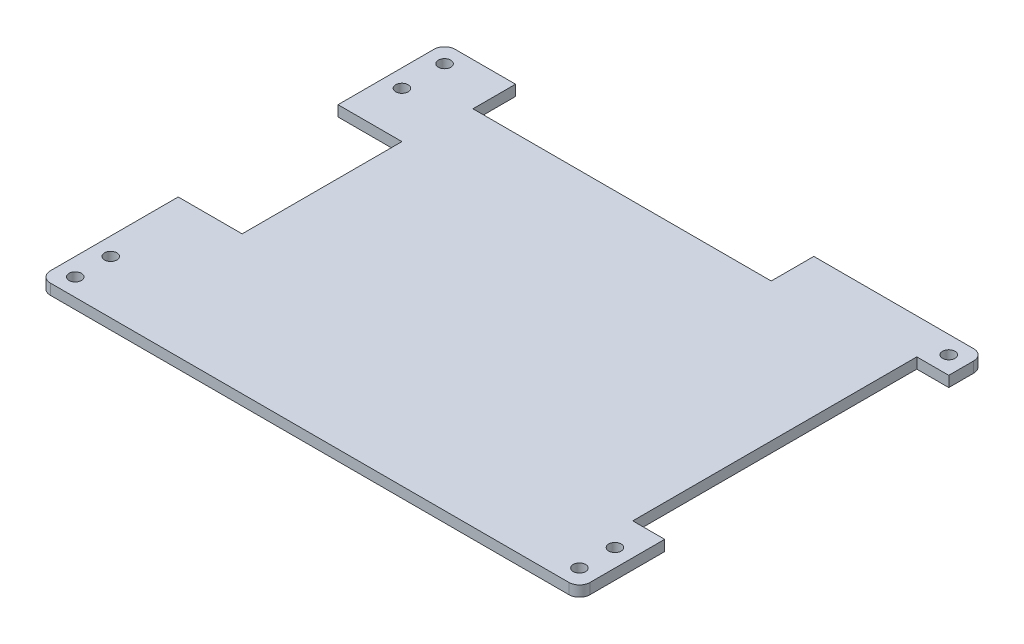
ISO-10303-21;
HEADER;
FILE_DESCRIPTION(('STEP AP214'),'2;1');
FILE_NAME('part.step','',(''),(''),'','','');
FILE_SCHEMA(('AUTOMOTIVE_DESIGN { 1 0 10303 214 1 1 1 1 }'));
ENDSEC;
DATA;
#1=APPLICATION_CONTEXT('core data for automotive mechanical design processes');
#2=APPLICATION_PROTOCOL_DEFINITION('international standard','automotive_design',2000,#1);
#3=PRODUCT_CONTEXT('',#1,'mechanical');
#4=PRODUCT('Part','Part','',(#3));
#5=PRODUCT_RELATED_PRODUCT_CATEGORY('part','',(#4));
#6=PRODUCT_DEFINITION_FORMATION('','',#4);
#7=PRODUCT_DEFINITION_CONTEXT('part definition',#1,'design');
#8=PRODUCT_DEFINITION('design','',#6,#7);
#9=PRODUCT_DEFINITION_SHAPE('','',#8);
#10=(LENGTH_UNIT() NAMED_UNIT(*) SI_UNIT(.MILLI.,.METRE.));
#11=(NAMED_UNIT(*) PLANE_ANGLE_UNIT() SI_UNIT($,.RADIAN.));
#12=(NAMED_UNIT(*) SI_UNIT($,.STERADIAN.) SOLID_ANGLE_UNIT());
#13=UNCERTAINTY_MEASURE_WITH_UNIT(LENGTH_MEASURE(1.E-05),#10,'distance_accuracy_value','');
#14=(GEOMETRIC_REPRESENTATION_CONTEXT(3) GLOBAL_UNCERTAINTY_ASSIGNED_CONTEXT((#13)) GLOBAL_UNIT_ASSIGNED_CONTEXT((#10,
#11,#12)) REPRESENTATION_CONTEXT('',''));
#15=CARTESIAN_POINT('',(0.,0.,0.));
#16=DIRECTION('',(0.,0.,1.));
#17=DIRECTION('',(1.,0.,0.));
#18=AXIS2_PLACEMENT_3D('',#15,#16,#17);
#19=CARTESIAN_POINT('',(-73.,3.,-54.));
#20=DIRECTION('',(0.,1.,0.));
#21=DIRECTION('',(0.,0.,1.));
#22=AXIS2_PLACEMENT_3D('',#19,#20,#21);
#23=PLANE('',#22);
#24=CARTESIAN_POINT('',(71.0000000000009,3.,42.));
#25=DIRECTION('',(0.,1.,0.));
#26=DIRECTION('',(0.,0.,1.));
#27=AXIS2_PLACEMENT_3D('',#24,#25,#26);
#28=CIRCLE('',#27,1.75);
#29=CARTESIAN_POINT('',(71.0000000000009,3.,43.75));
#30=VERTEX_POINT('',#29);
#31=EDGE_CURVE('E411',#30,#30,#28,.T.);
#32=ORIENTED_EDGE('',*,*,#31,.F.);
#33=EDGE_LOOP('',(#32));
#34=FACE_BOUND('',#33,.T.);
#35=CARTESIAN_POINT('',(-70.9999999999989,3.,52.));
#36=DIRECTION('',(0.,1.,0.));
#37=DIRECTION('',(0.,0.,1.));
#38=AXIS2_PLACEMENT_3D('',#35,#36,#37);
#39=CIRCLE('',#38,1.75);
#40=CARTESIAN_POINT('',(-70.9999999999989,3.,53.75));
#41=VERTEX_POINT('',#40);
#42=EDGE_CURVE('E423',#41,#41,#39,.T.);
#43=ORIENTED_EDGE('',*,*,#42,.F.);
#44=EDGE_LOOP('',(#43));
#45=FACE_BOUND('',#44,.T.);
#46=CARTESIAN_POINT('',(71.,3.,-52.));
#47=DIRECTION('',(0.,1.,0.));
#48=DIRECTION('',(0.,0.,1.));
#49=AXIS2_PLACEMENT_3D('',#46,#47,#48);
#50=CIRCLE('',#49,1.75);
#51=CARTESIAN_POINT('',(71.,3.,-50.25));
#52=VERTEX_POINT('',#51);
#53=EDGE_CURVE('E435',#52,#52,#50,.T.);
#54=ORIENTED_EDGE('',*,*,#53,.F.);
#55=EDGE_LOOP('',(#54));
#56=FACE_BOUND('',#55,.T.);
#57=CARTESIAN_POINT('',(-73.,3.,-54.));
#58=DIRECTION('',(0.,1.,0.));
#59=DIRECTION('',(0.,0.,1.));
#60=AXIS2_PLACEMENT_3D('',#57,#58,#59);
#61=CIRCLE('',#60,3.);
#62=CARTESIAN_POINT('',(-73.,3.,-57.));
#63=VERTEX_POINT('',#62);
#64=CARTESIAN_POINT('',(-76.,3.,-54.));
#65=VERTEX_POINT('',#64);
#66=EDGE_CURVE('E245',#63,#65,#61,.T.);
#67=ORIENTED_EDGE('',*,*,#66,.T.);
#68=DIRECTION('',(0.,0.,1.));
#69=VECTOR('',#68,1.);
#70=CARTESIAN_POINT('',(-76.,3.,-54.));
#71=LINE('',#70,#69);
#72=CARTESIAN_POINT('',(-76.,3.,-27.));
#73=VERTEX_POINT('',#72);
#74=EDGE_CURVE('E133',#65,#73,#71,.T.);
#75=ORIENTED_EDGE('',*,*,#74,.T.);
#76=DIRECTION('',(1.,0.,0.));
#77=VECTOR('',#76,1.);
#78=CARTESIAN_POINT('',(-76.,3.,-27.));
#79=LINE('',#78,#77);
#80=CARTESIAN_POINT('',(-58.,3.,-27.));
#81=VERTEX_POINT('',#80);
#82=EDGE_CURVE('E296',#73,#81,#79,.T.);
#83=ORIENTED_EDGE('',*,*,#82,.T.);
#84=DIRECTION('',(0.,0.,1.));
#85=VECTOR('',#84,1.);
#86=CARTESIAN_POINT('',(-58.,3.,-27.));
#87=LINE('',#86,#85);
#88=CARTESIAN_POINT('',(-58.,3.,18.));
#89=VERTEX_POINT('',#88);
#90=EDGE_CURVE('E315',#81,#89,#87,.T.);
#91=ORIENTED_EDGE('',*,*,#90,.T.);
#92=DIRECTION('',(-1.,0.,0.));
#93=VECTOR('',#92,1.);
#94=CARTESIAN_POINT('',(-58.,3.,18.));
#95=LINE('',#94,#93);
#96=CARTESIAN_POINT('',(-76.,3.,18.));
#97=VERTEX_POINT('',#96);
#98=EDGE_CURVE('E312',#89,#97,#95,.T.);
#99=ORIENTED_EDGE('',*,*,#98,.T.);
#100=DIRECTION('',(0.,0.,1.));
#101=VECTOR('',#100,1.);
#102=CARTESIAN_POINT('',(-76.,3.,18.));
#103=LINE('',#102,#101);
#104=CARTESIAN_POINT('',(-76.,3.,54.));
#105=VERTEX_POINT('',#104);
#106=EDGE_CURVE('E314',#97,#105,#103,.T.);
#107=ORIENTED_EDGE('',*,*,#106,.T.);
#108=CARTESIAN_POINT('',(-73.,3.,54.));
#109=DIRECTION('',(0.,1.,0.));
#110=DIRECTION('',(0.,0.,-1.));
#111=AXIS2_PLACEMENT_3D('',#108,#109,#110);
#112=CIRCLE('',#111,3.);
#113=CARTESIAN_POINT('',(-73.,3.,57.));
#114=VERTEX_POINT('',#113);
#115=EDGE_CURVE('E317',#105,#114,#112,.T.);
#116=ORIENTED_EDGE('',*,*,#115,.T.);
#117=DIRECTION('',(1.,0.,0.));
#118=VECTOR('',#117,1.);
#119=CARTESIAN_POINT('',(-73.,3.,57.));
#120=LINE('',#119,#118);
#121=CARTESIAN_POINT('',(73.,3.,57.));
#122=VERTEX_POINT('',#121);
#123=EDGE_CURVE('E323',#114,#122,#120,.T.);
#124=ORIENTED_EDGE('',*,*,#123,.T.);
#125=CARTESIAN_POINT('',(73.,3.,54.));
#126=DIRECTION('',(0.,1.,0.));
#127=DIRECTION('',(0.,0.,1.));
#128=AXIS2_PLACEMENT_3D('',#125,#126,#127);
#129=CIRCLE('',#128,3.);
#130=CARTESIAN_POINT('',(76.,3.,54.));
#131=VERTEX_POINT('',#130);
#132=EDGE_CURVE('E325',#122,#131,#129,.T.);
#133=ORIENTED_EDGE('',*,*,#132,.T.);
#134=DIRECTION('',(0.,0.,-1.));
#135=VECTOR('',#134,1.);
#136=CARTESIAN_POINT('',(76.,3.,33.));
#137=LINE('',#136,#135);
#138=CARTESIAN_POINT('',(76.,3.,33.));
#139=VERTEX_POINT('',#138);
#140=EDGE_CURVE('E327',#131,#139,#137,.T.);
#141=ORIENTED_EDGE('',*,*,#140,.T.);
#142=DIRECTION('',(-1.,0.,0.));
#143=VECTOR('',#142,1.);
#144=CARTESIAN_POINT('',(67.0000000000001,3.,33.));
#145=LINE('',#144,#143);
#146=CARTESIAN_POINT('',(67.0000000000001,3.,33.));
#147=VERTEX_POINT('',#146);
#148=EDGE_CURVE('E329',#139,#147,#145,.T.);
#149=ORIENTED_EDGE('',*,*,#148,.T.);
#150=DIRECTION('',(0.,0.,-1.));
#151=VECTOR('',#150,1.);
#152=CARTESIAN_POINT('',(67.,3.,-47.));
#153=LINE('',#152,#151);
#154=CARTESIAN_POINT('',(67.,3.,-47.));
#155=VERTEX_POINT('',#154);
#156=EDGE_CURVE('E331',#147,#155,#153,.T.);
#157=ORIENTED_EDGE('',*,*,#156,.T.);
#158=DIRECTION('',(1.,0.,0.));
#159=VECTOR('',#158,1.);
#160=CARTESIAN_POINT('',(76.,3.,-47.));
#161=LINE('',#160,#159);
#162=CARTESIAN_POINT('',(76.,3.,-47.));
#163=VERTEX_POINT('',#162);
#164=EDGE_CURVE('E333',#155,#163,#161,.T.);
#165=ORIENTED_EDGE('',*,*,#164,.T.);
#166=DIRECTION('',(0.,0.,-1.));
#167=VECTOR('',#166,1.);
#168=CARTESIAN_POINT('',(76.,3.,-54.));
#169=LINE('',#168,#167);
#170=CARTESIAN_POINT('',(76.,3.,-54.));
#171=VERTEX_POINT('',#170);
#172=EDGE_CURVE('E335',#163,#171,#169,.T.);
#173=ORIENTED_EDGE('',*,*,#172,.T.);
#174=CARTESIAN_POINT('',(73.,3.,-54.));
#175=DIRECTION('',(0.,1.,0.));
#176=DIRECTION('',(0.,0.,1.));
#177=AXIS2_PLACEMENT_3D('',#174,#175,#176);
#178=CIRCLE('',#177,3.);
#179=CARTESIAN_POINT('',(72.9999999999999,3.,-57.));
#180=VERTEX_POINT('',#179);
#181=EDGE_CURVE('E337',#171,#180,#178,.T.);
#182=ORIENTED_EDGE('',*,*,#181,.T.);
#183=DIRECTION('',(-1.,0.,0.));
#184=VECTOR('',#183,1.);
#185=CARTESIAN_POINT('',(28.,3.,-57.));
#186=LINE('',#185,#184);
#187=CARTESIAN_POINT('',(28.,3.,-57.));
#188=VERTEX_POINT('',#187);
#189=EDGE_CURVE('E339',#180,#188,#186,.T.);
#190=ORIENTED_EDGE('',*,*,#189,.T.);
#191=DIRECTION('',(0.,0.,1.));
#192=VECTOR('',#191,1.);
#193=CARTESIAN_POINT('',(28.,3.,-45.));
#194=LINE('',#193,#192);
#195=CARTESIAN_POINT('',(28.,3.,-45.));
#196=VERTEX_POINT('',#195);
#197=EDGE_CURVE('E188',#188,#196,#194,.T.);
#198=ORIENTED_EDGE('',*,*,#197,.T.);
#199=DIRECTION('',(-1.,0.,0.));
#200=VECTOR('',#199,1.);
#201=CARTESIAN_POINT('',(-56.,3.,-45.));
#202=LINE('',#201,#200);
#203=CARTESIAN_POINT('',(-56.,3.,-45.));
#204=VERTEX_POINT('',#203);
#205=EDGE_CURVE('E182',#196,#204,#202,.T.);
#206=ORIENTED_EDGE('',*,*,#205,.T.);
#207=DIRECTION('',(0.,0.,-1.));
#208=VECTOR('',#207,1.);
#209=CARTESIAN_POINT('',(-56.,3.,-57.));
#210=LINE('',#209,#208);
#211=CARTESIAN_POINT('',(-56.,3.,-57.));
#212=VERTEX_POINT('',#211);
#213=EDGE_CURVE('E186',#204,#212,#210,.T.);
#214=ORIENTED_EDGE('',*,*,#213,.T.);
#215=DIRECTION('',(-1.,0.,0.));
#216=VECTOR('',#215,1.);
#217=CARTESIAN_POINT('',(-73.,3.,-57.));
#218=LINE('',#217,#216);
#219=EDGE_CURVE('E54',#212,#63,#218,.T.);
#220=ORIENTED_EDGE('',*,*,#219,.T.);
#221=EDGE_LOOP('',(#67,#75,#83,#91,#99,#107,#116,#124,#133,#141,#149,#157,#165,#173,#182,#190,
#198,#206,#214,#220));
#222=FACE_BOUND('',#221,.T.);
#223=CARTESIAN_POINT('',(-71.,3.,-52.));
#224=DIRECTION('',(0.,1.,0.));
#225=DIRECTION('',(0.,0.,1.));
#226=AXIS2_PLACEMENT_3D('',#223,#224,#225);
#227=CIRCLE('',#226,1.75);
#228=CARTESIAN_POINT('',(-71.,3.,-50.25));
#229=VERTEX_POINT('',#228);
#230=EDGE_CURVE('E210',#229,#229,#227,.T.);
#231=ORIENTED_EDGE('',*,*,#230,.F.);
#232=EDGE_LOOP('',(#231));
#233=FACE_BOUND('',#232,.T.);
#234=CARTESIAN_POINT('',(71.0000000000011,3.,52.));
#235=DIRECTION('',(0.,1.,0.));
#236=DIRECTION('',(0.,0.,1.));
#237=AXIS2_PLACEMENT_3D('',#234,#235,#236);
#238=CIRCLE('',#237,1.75);
#239=CARTESIAN_POINT('',(71.0000000000011,3.,53.75));
#240=VERTEX_POINT('',#239);
#241=EDGE_CURVE('E429',#240,#240,#238,.T.);
#242=ORIENTED_EDGE('',*,*,#241,.F.);
#243=EDGE_LOOP('',(#242));
#244=FACE_BOUND('',#243,.T.);
#245=CARTESIAN_POINT('',(-71.,3.,-40.));
#246=DIRECTION('',(0.,1.,0.));
#247=DIRECTION('',(0.,0.,1.));
#248=AXIS2_PLACEMENT_3D('',#245,#246,#247);
#249=CIRCLE('',#248,1.75);
#250=CARTESIAN_POINT('',(-71.,3.,-38.25));
#251=VERTEX_POINT('',#250);
#252=EDGE_CURVE('E417',#251,#251,#249,.T.);
#253=ORIENTED_EDGE('',*,*,#252,.F.);
#254=EDGE_LOOP('',(#253));
#255=FACE_BOUND('',#254,.T.);
#256=CARTESIAN_POINT('',(-70.9999999999991,3.,42.));
#257=DIRECTION('',(0.,1.,0.));
#258=DIRECTION('',(0.,0.,1.));
#259=AXIS2_PLACEMENT_3D('',#256,#257,#258);
#260=CIRCLE('',#259,1.75);
#261=CARTESIAN_POINT('',(-70.9999999999991,3.,43.75));
#262=VERTEX_POINT('',#261);
#263=EDGE_CURVE('E402',#262,#262,#260,.T.);
#264=ORIENTED_EDGE('',*,*,#263,.F.);
#265=EDGE_LOOP('',(#264));
#266=FACE_BOUND('',#265,.T.);
#267=ADVANCED_FACE('F37',(#34,#45,#56,#222,#233,#244,#255,#266),#23,.T.);
#268=CARTESIAN_POINT('',(-73.,0.,-54.));
#269=DIRECTION('',(0.,1.,0.));
#270=DIRECTION('',(0.,0.,1.));
#271=AXIS2_PLACEMENT_3D('',#268,#269,#270);
#272=PLANE('',#271);
#273=CARTESIAN_POINT('',(-73.,0.,-54.));
#274=DIRECTION('',(0.,1.,0.));
#275=DIRECTION('',(0.,0.,1.));
#276=AXIS2_PLACEMENT_3D('',#273,#274,#275);
#277=CIRCLE('',#276,3.);
#278=CARTESIAN_POINT('',(-73.,0.,-57.));
#279=VERTEX_POINT('',#278);
#280=CARTESIAN_POINT('',(-76.,0.,-54.));
#281=VERTEX_POINT('',#280);
#282=EDGE_CURVE('E206',#279,#281,#277,.T.);
#283=ORIENTED_EDGE('',*,*,#282,.F.);
#284=DIRECTION('',(-1.,0.,0.));
#285=VECTOR('',#284,1.);
#286=CARTESIAN_POINT('',(-73.,0.,-57.));
#287=LINE('',#286,#285);
#288=CARTESIAN_POINT('',(-56.,0.,-57.));
#289=VERTEX_POINT('',#288);
#290=EDGE_CURVE('E125',#289,#279,#287,.T.);
#291=ORIENTED_EDGE('',*,*,#290,.F.);
#292=DIRECTION('',(0.,0.,-1.));
#293=VECTOR('',#292,1.);
#294=CARTESIAN_POINT('',(-56.,0.,-57.));
#295=LINE('',#294,#293);
#296=CARTESIAN_POINT('',(-56.,0.,-45.));
#297=VERTEX_POINT('',#296);
#298=EDGE_CURVE('E119',#297,#289,#295,.T.);
#299=ORIENTED_EDGE('',*,*,#298,.F.);
#300=DIRECTION('',(-1.,0.,0.));
#301=VECTOR('',#300,1.);
#302=CARTESIAN_POINT('',(-56.,0.,-45.));
#303=LINE('',#302,#301);
#304=CARTESIAN_POINT('',(28.,0.,-45.));
#305=VERTEX_POINT('',#304);
#306=EDGE_CURVE('E196',#305,#297,#303,.T.);
#307=ORIENTED_EDGE('',*,*,#306,.F.);
#308=DIRECTION('',(0.,0.,1.));
#309=VECTOR('',#308,1.);
#310=CARTESIAN_POINT('',(28.,0.,-45.));
#311=LINE('',#310,#309);
#312=CARTESIAN_POINT('',(28.,0.,-57.));
#313=VERTEX_POINT('',#312);
#314=EDGE_CURVE('E240',#313,#305,#311,.T.);
#315=ORIENTED_EDGE('',*,*,#314,.F.);
#316=DIRECTION('',(-1.,0.,0.));
#317=VECTOR('',#316,1.);
#318=CARTESIAN_POINT('',(28.,0.,-57.));
#319=LINE('',#318,#317);
#320=CARTESIAN_POINT('',(72.9999999999999,0.,-57.));
#321=VERTEX_POINT('',#320);
#322=EDGE_CURVE('E238',#321,#313,#319,.T.);
#323=ORIENTED_EDGE('',*,*,#322,.F.);
#324=CARTESIAN_POINT('',(73.,0.,-54.));
#325=DIRECTION('',(0.,1.,0.));
#326=DIRECTION('',(0.,0.,1.));
#327=AXIS2_PLACEMENT_3D('',#324,#325,#326);
#328=CIRCLE('',#327,3.);
#329=CARTESIAN_POINT('',(76.,0.,-54.));
#330=VERTEX_POINT('',#329);
#331=EDGE_CURVE('E236',#330,#321,#328,.T.);
#332=ORIENTED_EDGE('',*,*,#331,.F.);
#333=DIRECTION('',(0.,0.,-1.));
#334=VECTOR('',#333,1.);
#335=CARTESIAN_POINT('',(76.,0.,-54.));
#336=LINE('',#335,#334);
#337=CARTESIAN_POINT('',(76.,0.,-47.));
#338=VERTEX_POINT('',#337);
#339=EDGE_CURVE('E234',#338,#330,#336,.T.);
#340=ORIENTED_EDGE('',*,*,#339,.F.);
#341=DIRECTION('',(1.,0.,0.));
#342=VECTOR('',#341,1.);
#343=CARTESIAN_POINT('',(76.,0.,-47.));
#344=LINE('',#343,#342);
#345=CARTESIAN_POINT('',(67.,0.,-47.));
#346=VERTEX_POINT('',#345);
#347=EDGE_CURVE('E232',#346,#338,#344,.T.);
#348=ORIENTED_EDGE('',*,*,#347,.F.);
#349=DIRECTION('',(0.,0.,-1.));
#350=VECTOR('',#349,1.);
#351=CARTESIAN_POINT('',(67.,0.,-47.));
#352=LINE('',#351,#350);
#353=CARTESIAN_POINT('',(67.0000000000001,0.,33.));
#354=VERTEX_POINT('',#353);
#355=EDGE_CURVE('E230',#354,#346,#352,.T.);
#356=ORIENTED_EDGE('',*,*,#355,.F.);
#357=DIRECTION('',(-1.,0.,0.));
#358=VECTOR('',#357,1.);
#359=CARTESIAN_POINT('',(67.0000000000001,0.,33.));
#360=LINE('',#359,#358);
#361=CARTESIAN_POINT('',(76.,0.,33.));
#362=VERTEX_POINT('',#361);
#363=EDGE_CURVE('E228',#362,#354,#360,.T.);
#364=ORIENTED_EDGE('',*,*,#363,.F.);
#365=DIRECTION('',(0.,0.,-1.));
#366=VECTOR('',#365,1.);
#367=CARTESIAN_POINT('',(76.,0.,33.));
#368=LINE('',#367,#366);
#369=CARTESIAN_POINT('',(76.,0.,54.));
#370=VERTEX_POINT('',#369);
#371=EDGE_CURVE('E226',#370,#362,#368,.T.);
#372=ORIENTED_EDGE('',*,*,#371,.F.);
#373=CARTESIAN_POINT('',(73.,0.,54.));
#374=DIRECTION('',(0.,1.,0.));
#375=DIRECTION('',(0.,0.,1.));
#376=AXIS2_PLACEMENT_3D('',#373,#374,#375);
#377=CIRCLE('',#376,3.);
#378=CARTESIAN_POINT('',(73.,0.,57.));
#379=VERTEX_POINT('',#378);
#380=EDGE_CURVE('E224',#379,#370,#377,.T.);
#381=ORIENTED_EDGE('',*,*,#380,.F.);
#382=DIRECTION('',(1.,0.,0.));
#383=VECTOR('',#382,1.);
#384=CARTESIAN_POINT('',(-73.,0.,57.));
#385=LINE('',#384,#383);
#386=CARTESIAN_POINT('',(-73.,0.,57.));
#387=VERTEX_POINT('',#386);
#388=EDGE_CURVE('E222',#387,#379,#385,.T.);
#389=ORIENTED_EDGE('',*,*,#388,.F.);
#390=CARTESIAN_POINT('',(-73.,0.,54.));
#391=DIRECTION('',(0.,1.,0.));
#392=DIRECTION('',(0.,0.,-1.));
#393=AXIS2_PLACEMENT_3D('',#390,#391,#392);
#394=CIRCLE('',#393,3.);
#395=CARTESIAN_POINT('',(-76.,0.,54.));
#396=VERTEX_POINT('',#395);
#397=EDGE_CURVE('E220',#396,#387,#394,.T.);
#398=ORIENTED_EDGE('',*,*,#397,.F.);
#399=DIRECTION('',(0.,0.,1.));
#400=VECTOR('',#399,1.);
#401=CARTESIAN_POINT('',(-76.,0.,18.));
#402=LINE('',#401,#400);
#403=CARTESIAN_POINT('',(-76.,0.,18.));
#404=VERTEX_POINT('',#403);
#405=EDGE_CURVE('E218',#404,#396,#402,.T.);
#406=ORIENTED_EDGE('',*,*,#405,.F.);
#407=DIRECTION('',(-1.,0.,0.));
#408=VECTOR('',#407,1.);
#409=CARTESIAN_POINT('',(-58.,0.,18.));
#410=LINE('',#409,#408);
#411=CARTESIAN_POINT('',(-58.,0.,18.));
#412=VERTEX_POINT('',#411);
#413=EDGE_CURVE('E216',#412,#404,#410,.T.);
#414=ORIENTED_EDGE('',*,*,#413,.F.);
#415=DIRECTION('',(0.,0.,1.));
#416=VECTOR('',#415,1.);
#417=CARTESIAN_POINT('',(-58.,0.,-27.));
#418=LINE('',#417,#416);
#419=CARTESIAN_POINT('',(-58.,0.,-27.));
#420=VERTEX_POINT('',#419);
#421=EDGE_CURVE('E214',#420,#412,#418,.T.);
#422=ORIENTED_EDGE('',*,*,#421,.F.);
#423=DIRECTION('',(1.,0.,0.));
#424=VECTOR('',#423,1.);
#425=CARTESIAN_POINT('',(-76.,0.,-27.));
#426=LINE('',#425,#424);
#427=CARTESIAN_POINT('',(-76.,0.,-27.));
#428=VERTEX_POINT('',#427);
#429=EDGE_CURVE('E212',#428,#420,#426,.T.);
#430=ORIENTED_EDGE('',*,*,#429,.F.);
#431=DIRECTION('',(0.,0.,1.));
#432=VECTOR('',#431,1.);
#433=CARTESIAN_POINT('',(-76.,0.,-54.));
#434=LINE('',#433,#432);
#435=EDGE_CURVE('E209',#281,#428,#434,.T.);
#436=ORIENTED_EDGE('',*,*,#435,.F.);
#437=EDGE_LOOP('',(#283,#291,#299,#307,#315,#323,#332,#340,#348,#356,#364,#372,#381,#389,#398,
#406,#414,#422,#430,#436));
#438=FACE_BOUND('',#437,.T.);
#439=CARTESIAN_POINT('',(-71.,0.,-52.));
#440=DIRECTION('',(0.,1.,0.));
#441=DIRECTION('',(0.,0.,1.));
#442=AXIS2_PLACEMENT_3D('',#439,#440,#441);
#443=CIRCLE('',#442,1.75);
#444=CARTESIAN_POINT('',(-71.,0.,-50.25));
#445=VERTEX_POINT('',#444);
#446=EDGE_CURVE('E438',#445,#445,#443,.T.);
#447=ORIENTED_EDGE('',*,*,#446,.T.);
#448=EDGE_LOOP('',(#447));
#449=FACE_BOUND('',#448,.T.);
#450=CARTESIAN_POINT('',(71.,0.,-52.));
#451=DIRECTION('',(0.,1.,0.));
#452=DIRECTION('',(0.,0.,1.));
#453=AXIS2_PLACEMENT_3D('',#450,#451,#452);
#454=CIRCLE('',#453,1.75);
#455=CARTESIAN_POINT('',(71.,0.,-50.25));
#456=VERTEX_POINT('',#455);
#457=EDGE_CURVE('E432',#456,#456,#454,.T.);
#458=ORIENTED_EDGE('',*,*,#457,.T.);
#459=EDGE_LOOP('',(#458));
#460=FACE_BOUND('',#459,.T.);
#461=CARTESIAN_POINT('',(71.0000000000011,0.,52.));
#462=DIRECTION('',(0.,1.,0.));
#463=DIRECTION('',(0.,0.,1.));
#464=AXIS2_PLACEMENT_3D('',#461,#462,#463);
#465=CIRCLE('',#464,1.75);
#466=CARTESIAN_POINT('',(71.0000000000011,0.,53.75));
#467=VERTEX_POINT('',#466);
#468=EDGE_CURVE('E426',#467,#467,#465,.T.);
#469=ORIENTED_EDGE('',*,*,#468,.T.);
#470=EDGE_LOOP('',(#469));
#471=FACE_BOUND('',#470,.T.);
#472=CARTESIAN_POINT('',(-70.9999999999989,0.,52.));
#473=DIRECTION('',(0.,1.,0.));
#474=DIRECTION('',(0.,0.,1.));
#475=AXIS2_PLACEMENT_3D('',#472,#473,#474);
#476=CIRCLE('',#475,1.75);
#477=CARTESIAN_POINT('',(-70.9999999999989,0.,53.75));
#478=VERTEX_POINT('',#477);
#479=EDGE_CURVE('E420',#478,#478,#476,.T.);
#480=ORIENTED_EDGE('',*,*,#479,.T.);
#481=EDGE_LOOP('',(#480));
#482=FACE_BOUND('',#481,.T.);
#483=CARTESIAN_POINT('',(-71.,0.,-40.));
#484=DIRECTION('',(0.,1.,0.));
#485=DIRECTION('',(0.,0.,1.));
#486=AXIS2_PLACEMENT_3D('',#483,#484,#485);
#487=CIRCLE('',#486,1.75);
#488=CARTESIAN_POINT('',(-71.,0.,-38.25));
#489=VERTEX_POINT('',#488);
#490=EDGE_CURVE('E414',#489,#489,#487,.T.);
#491=ORIENTED_EDGE('',*,*,#490,.T.);
#492=EDGE_LOOP('',(#491));
#493=FACE_BOUND('',#492,.T.);
#494=CARTESIAN_POINT('',(71.0000000000009,0.,42.));
#495=DIRECTION('',(0.,1.,0.));
#496=DIRECTION('',(0.,0.,1.));
#497=AXIS2_PLACEMENT_3D('',#494,#495,#496);
#498=CIRCLE('',#497,1.75);
#499=CARTESIAN_POINT('',(71.0000000000009,0.,43.75));
#500=VERTEX_POINT('',#499);
#501=EDGE_CURVE('E408',#500,#500,#498,.T.);
#502=ORIENTED_EDGE('',*,*,#501,.T.);
#503=EDGE_LOOP('',(#502));
#504=FACE_BOUND('',#503,.T.);
#505=CARTESIAN_POINT('',(-70.9999999999991,0.,42.));
#506=DIRECTION('',(0.,1.,0.));
#507=DIRECTION('',(0.,0.,1.));
#508=AXIS2_PLACEMENT_3D('',#505,#506,#507);
#509=CIRCLE('',#508,1.75);
#510=CARTESIAN_POINT('',(-70.9999999999991,0.,43.75));
#511=VERTEX_POINT('',#510);
#512=EDGE_CURVE('E405',#511,#511,#509,.T.);
#513=ORIENTED_EDGE('',*,*,#512,.T.);
#514=EDGE_LOOP('',(#513));
#515=FACE_BOUND('',#514,.T.);
#516=ADVANCED_FACE('F300',(#438,#449,#460,#471,#482,#493,#504,#515),#272,.F.);
#517=CARTESIAN_POINT('',(-73.,3.,-54.));
#518=DIRECTION('',(0.,-1.,0.));
#519=DIRECTION('',(0.,0.,-1.));
#520=AXIS2_PLACEMENT_3D('',#517,#518,#519);
#521=CYLINDRICAL_SURFACE('',#520,3.);
#522=ORIENTED_EDGE('',*,*,#282,.T.);
#523=DIRECTION('',(0.,-1.,0.));
#524=VECTOR('',#523,1.);
#525=CARTESIAN_POINT('',(-76.,3.,-54.));
#526=LINE('',#525,#524);
#527=EDGE_CURVE('E11',#65,#281,#526,.T.);
#528=ORIENTED_EDGE('',*,*,#527,.F.);
#529=ORIENTED_EDGE('',*,*,#66,.F.);
#530=DIRECTION('',(0.,-1.,0.));
#531=VECTOR('',#530,1.);
#532=CARTESIAN_POINT('',(-73.,3.,-57.));
#533=LINE('',#532,#531);
#534=EDGE_CURVE('E202',#63,#279,#533,.T.);
#535=ORIENTED_EDGE('',*,*,#534,.T.);
#536=EDGE_LOOP('',(#522,#528,#529,#535));
#537=FACE_BOUND('',#536,.T.);
#538=ADVANCED_FACE('F39',(#537),#521,.T.);
#539=CARTESIAN_POINT('',(-76.,3.,-54.));
#540=DIRECTION('',(1.,0.,0.));
#541=DIRECTION('',(0.,0.,-1.));
#542=AXIS2_PLACEMENT_3D('',#539,#540,#541);
#543=PLANE('',#542);
#544=ORIENTED_EDGE('',*,*,#435,.T.);
#545=DIRECTION('',(0.,-1.,0.));
#546=VECTOR('',#545,1.);
#547=CARTESIAN_POINT('',(-76.,3.,-27.));
#548=LINE('',#547,#546);
#549=EDGE_CURVE('E46',#73,#428,#548,.T.);
#550=ORIENTED_EDGE('',*,*,#549,.F.);
#551=ORIENTED_EDGE('',*,*,#74,.F.);
#552=ORIENTED_EDGE('',*,*,#527,.T.);
#553=EDGE_LOOP('',(#544,#550,#551,#552));
#554=FACE_BOUND('',#553,.T.);
#555=ADVANCED_FACE('F673',(#554),#543,.F.);
#556=CARTESIAN_POINT('',(-76.,3.,-27.));
#557=DIRECTION('',(0.,0.,-1.));
#558=DIRECTION('',(-1.,0.,0.));
#559=AXIS2_PLACEMENT_3D('',#556,#557,#558);
#560=PLANE('',#559);
#561=ORIENTED_EDGE('',*,*,#429,.T.);
#562=DIRECTION('',(0.,-1.,0.));
#563=VECTOR('',#562,1.);
#564=CARTESIAN_POINT('',(-58.,3.,-27.));
#565=LINE('',#564,#563);
#566=EDGE_CURVE('E288',#81,#420,#565,.T.);
#567=ORIENTED_EDGE('',*,*,#566,.F.);
#568=ORIENTED_EDGE('',*,*,#82,.F.);
#569=ORIENTED_EDGE('',*,*,#549,.T.);
#570=EDGE_LOOP('',(#561,#567,#568,#569));
#571=FACE_BOUND('',#570,.T.);
#572=ADVANCED_FACE('F294',(#571),#560,.F.);
#573=CARTESIAN_POINT('',(-58.,3.,-27.));
#574=DIRECTION('',(1.,0.,0.));
#575=DIRECTION('',(0.,0.,-1.));
#576=AXIS2_PLACEMENT_3D('',#573,#574,#575);
#577=PLANE('',#576);
#578=ORIENTED_EDGE('',*,*,#421,.T.);
#579=DIRECTION('',(0.,-1.,0.));
#580=VECTOR('',#579,1.);
#581=CARTESIAN_POINT('',(-58.,3.,18.));
#582=LINE('',#581,#580);
#583=EDGE_CURVE('E285',#89,#412,#582,.T.);
#584=ORIENTED_EDGE('',*,*,#583,.F.);
#585=ORIENTED_EDGE('',*,*,#90,.F.);
#586=ORIENTED_EDGE('',*,*,#566,.T.);
#587=EDGE_LOOP('',(#578,#584,#585,#586));
#588=FACE_BOUND('',#587,.T.);
#589=ADVANCED_FACE('F306',(#588),#577,.F.);
#590=CARTESIAN_POINT('',(-58.,3.,18.));
#591=DIRECTION('',(0.,0.,1.));
#592=DIRECTION('',(1.,0.,0.));
#593=AXIS2_PLACEMENT_3D('',#590,#591,#592);
#594=PLANE('',#593);
#595=ORIENTED_EDGE('',*,*,#413,.T.);
#596=DIRECTION('',(0.,-1.,0.));
#597=VECTOR('',#596,1.);
#598=CARTESIAN_POINT('',(-76.,3.,18.));
#599=LINE('',#598,#597);
#600=EDGE_CURVE('E282',#97,#404,#599,.T.);
#601=ORIENTED_EDGE('',*,*,#600,.F.);
#602=ORIENTED_EDGE('',*,*,#98,.F.);
#603=ORIENTED_EDGE('',*,*,#583,.T.);
#604=EDGE_LOOP('',(#595,#601,#602,#603));
#605=FACE_BOUND('',#604,.T.);
#606=ADVANCED_FACE('F310',(#605),#594,.F.);
#607=CARTESIAN_POINT('',(-76.,3.,18.));
#608=DIRECTION('',(1.,0.,0.));
#609=DIRECTION('',(0.,0.,-1.));
#610=AXIS2_PLACEMENT_3D('',#607,#608,#609);
#611=PLANE('',#610);
#612=ORIENTED_EDGE('',*,*,#405,.T.);
#613=DIRECTION('',(0.,-1.,0.));
#614=VECTOR('',#613,1.);
#615=CARTESIAN_POINT('',(-76.,3.,54.));
#616=LINE('',#615,#614);
#617=EDGE_CURVE('E279',#105,#396,#616,.T.);
#618=ORIENTED_EDGE('',*,*,#617,.F.);
#619=ORIENTED_EDGE('',*,*,#106,.F.);
#620=ORIENTED_EDGE('',*,*,#600,.T.);
#621=EDGE_LOOP('',(#612,#618,#619,#620));
#622=FACE_BOUND('',#621,.T.);
#623=ADVANCED_FACE('F634',(#622),#611,.F.);
#624=CARTESIAN_POINT('',(-73.,3.,54.));
#625=DIRECTION('',(0.,-1.,0.));
#626=DIRECTION('',(0.,0.,-1.));
#627=AXIS2_PLACEMENT_3D('',#624,#625,#626);
#628=CYLINDRICAL_SURFACE('',#627,3.);
#629=ORIENTED_EDGE('',*,*,#397,.T.);
#630=DIRECTION('',(0.,-1.,0.));
#631=VECTOR('',#630,1.);
#632=CARTESIAN_POINT('',(-73.,3.,57.));
#633=LINE('',#632,#631);
#634=EDGE_CURVE('E276',#114,#387,#633,.T.);
#635=ORIENTED_EDGE('',*,*,#634,.F.);
#636=ORIENTED_EDGE('',*,*,#115,.F.);
#637=ORIENTED_EDGE('',*,*,#617,.T.);
#638=EDGE_LOOP('',(#629,#635,#636,#637));
#639=FACE_BOUND('',#638,.T.);
#640=ADVANCED_FACE('F623',(#639),#628,.T.);
#641=CARTESIAN_POINT('',(-73.,3.,57.));
#642=DIRECTION('',(0.,0.,-1.));
#643=DIRECTION('',(-1.,0.,0.));
#644=AXIS2_PLACEMENT_3D('',#641,#642,#643);
#645=PLANE('',#644);
#646=ORIENTED_EDGE('',*,*,#388,.T.);
#647=DIRECTION('',(0.,-1.,0.));
#648=VECTOR('',#647,1.);
#649=CARTESIAN_POINT('',(73.,3.,57.));
#650=LINE('',#649,#648);
#651=EDGE_CURVE('E273',#122,#379,#650,.T.);
#652=ORIENTED_EDGE('',*,*,#651,.F.);
#653=ORIENTED_EDGE('',*,*,#123,.F.);
#654=ORIENTED_EDGE('',*,*,#634,.T.);
#655=EDGE_LOOP('',(#646,#652,#653,#654));
#656=FACE_BOUND('',#655,.T.);
#657=ADVANCED_FACE('F612',(#656),#645,.F.);
#658=CARTESIAN_POINT('',(73.,3.,54.));
#659=DIRECTION('',(0.,-1.,0.));
#660=DIRECTION('',(0.,0.,-1.));
#661=AXIS2_PLACEMENT_3D('',#658,#659,#660);
#662=CYLINDRICAL_SURFACE('',#661,3.);
#663=ORIENTED_EDGE('',*,*,#380,.T.);
#664=DIRECTION('',(0.,-1.,0.));
#665=VECTOR('',#664,1.);
#666=CARTESIAN_POINT('',(76.,3.,54.));
#667=LINE('',#666,#665);
#668=EDGE_CURVE('E270',#131,#370,#667,.T.);
#669=ORIENTED_EDGE('',*,*,#668,.F.);
#670=ORIENTED_EDGE('',*,*,#132,.F.);
#671=ORIENTED_EDGE('',*,*,#651,.T.);
#672=EDGE_LOOP('',(#663,#669,#670,#671));
#673=FACE_BOUND('',#672,.T.);
#674=ADVANCED_FACE('F601',(#673),#662,.T.);
#675=CARTESIAN_POINT('',(76.,3.,33.));
#676=DIRECTION('',(-1.,0.,0.));
#677=DIRECTION('',(0.,0.,1.));
#678=AXIS2_PLACEMENT_3D('',#675,#676,#677);
#679=PLANE('',#678);
#680=ORIENTED_EDGE('',*,*,#371,.T.);
#681=DIRECTION('',(0.,-1.,0.));
#682=VECTOR('',#681,1.);
#683=CARTESIAN_POINT('',(76.,3.,33.));
#684=LINE('',#683,#682);
#685=EDGE_CURVE('E267',#139,#362,#684,.T.);
#686=ORIENTED_EDGE('',*,*,#685,.F.);
#687=ORIENTED_EDGE('',*,*,#140,.F.);
#688=ORIENTED_EDGE('',*,*,#668,.T.);
#689=EDGE_LOOP('',(#680,#686,#687,#688));
#690=FACE_BOUND('',#689,.T.);
#691=ADVANCED_FACE('F590',(#690),#679,.F.);
#692=CARTESIAN_POINT('',(67.0000000000001,3.,33.));
#693=DIRECTION('',(0.,0.,1.));
#694=DIRECTION('',(1.,0.,0.));
#695=AXIS2_PLACEMENT_3D('',#692,#693,#694);
#696=PLANE('',#695);
#697=ORIENTED_EDGE('',*,*,#363,.T.);
#698=DIRECTION('',(0.,-1.,0.));
#699=VECTOR('',#698,1.);
#700=CARTESIAN_POINT('',(67.0000000000001,3.,33.));
#701=LINE('',#700,#699);
#702=EDGE_CURVE('E264',#147,#354,#701,.T.);
#703=ORIENTED_EDGE('',*,*,#702,.F.);
#704=ORIENTED_EDGE('',*,*,#148,.F.);
#705=ORIENTED_EDGE('',*,*,#685,.T.);
#706=EDGE_LOOP('',(#697,#703,#704,#705));
#707=FACE_BOUND('',#706,.T.);
#708=ADVANCED_FACE('F579',(#707),#696,.F.);
#709=CARTESIAN_POINT('',(67.,3.,-47.));
#710=DIRECTION('',(-1.,0.,0.));
#711=DIRECTION('',(0.,0.,1.));
#712=AXIS2_PLACEMENT_3D('',#709,#710,#711);
#713=PLANE('',#712);
#714=ORIENTED_EDGE('',*,*,#355,.T.);
#715=DIRECTION('',(0.,-1.,0.));
#716=VECTOR('',#715,1.);
#717=CARTESIAN_POINT('',(67.,3.,-47.));
#718=LINE('',#717,#716);
#719=EDGE_CURVE('E261',#155,#346,#718,.T.);
#720=ORIENTED_EDGE('',*,*,#719,.F.);
#721=ORIENTED_EDGE('',*,*,#156,.F.);
#722=ORIENTED_EDGE('',*,*,#702,.T.);
#723=EDGE_LOOP('',(#714,#720,#721,#722));
#724=FACE_BOUND('',#723,.T.);
#725=ADVANCED_FACE('F568',(#724),#713,.F.);
#726=CARTESIAN_POINT('',(76.,3.,-47.));
#727=DIRECTION('',(0.,0.,-1.));
#728=DIRECTION('',(-1.,0.,0.));
#729=AXIS2_PLACEMENT_3D('',#726,#727,#728);
#730=PLANE('',#729);
#731=ORIENTED_EDGE('',*,*,#347,.T.);
#732=DIRECTION('',(0.,-1.,0.));
#733=VECTOR('',#732,1.);
#734=CARTESIAN_POINT('',(76.,3.,-47.));
#735=LINE('',#734,#733);
#736=EDGE_CURVE('E258',#163,#338,#735,.T.);
#737=ORIENTED_EDGE('',*,*,#736,.F.);
#738=ORIENTED_EDGE('',*,*,#164,.F.);
#739=ORIENTED_EDGE('',*,*,#719,.T.);
#740=EDGE_LOOP('',(#731,#737,#738,#739));
#741=FACE_BOUND('',#740,.T.);
#742=ADVANCED_FACE('F557',(#741),#730,.F.);
#743=CARTESIAN_POINT('',(76.,3.,-54.));
#744=DIRECTION('',(-1.,0.,0.));
#745=DIRECTION('',(0.,0.,1.));
#746=AXIS2_PLACEMENT_3D('',#743,#744,#745);
#747=PLANE('',#746);
#748=ORIENTED_EDGE('',*,*,#339,.T.);
#749=DIRECTION('',(0.,-1.,0.));
#750=VECTOR('',#749,1.);
#751=CARTESIAN_POINT('',(76.,3.,-54.));
#752=LINE('',#751,#750);
#753=EDGE_CURVE('E255',#171,#330,#752,.T.);
#754=ORIENTED_EDGE('',*,*,#753,.F.);
#755=ORIENTED_EDGE('',*,*,#172,.F.);
#756=ORIENTED_EDGE('',*,*,#736,.T.);
#757=EDGE_LOOP('',(#748,#754,#755,#756));
#758=FACE_BOUND('',#757,.T.);
#759=ADVANCED_FACE('F546',(#758),#747,.F.);
#760=CARTESIAN_POINT('',(73.,3.,-54.));
#761=DIRECTION('',(0.,-1.,0.));
#762=DIRECTION('',(0.,0.,-1.));
#763=AXIS2_PLACEMENT_3D('',#760,#761,#762);
#764=CYLINDRICAL_SURFACE('',#763,3.);
#765=ORIENTED_EDGE('',*,*,#331,.T.);
#766=DIRECTION('',(0.,-1.,0.));
#767=VECTOR('',#766,1.);
#768=CARTESIAN_POINT('',(72.9999999999999,3.,-57.));
#769=LINE('',#768,#767);
#770=EDGE_CURVE('E252',#180,#321,#769,.T.);
#771=ORIENTED_EDGE('',*,*,#770,.F.);
#772=ORIENTED_EDGE('',*,*,#181,.F.);
#773=ORIENTED_EDGE('',*,*,#753,.T.);
#774=EDGE_LOOP('',(#765,#771,#772,#773));
#775=FACE_BOUND('',#774,.T.);
#776=ADVANCED_FACE('F536',(#775),#764,.T.);
#777=CARTESIAN_POINT('',(28.,3.,-57.));
#778=DIRECTION('',(0.,0.,1.));
#779=DIRECTION('',(1.,0.,0.));
#780=AXIS2_PLACEMENT_3D('',#777,#778,#779);
#781=PLANE('',#780);
#782=ORIENTED_EDGE('',*,*,#322,.T.);
#783=DIRECTION('',(0.,-1.,0.));
#784=VECTOR('',#783,1.);
#785=CARTESIAN_POINT('',(28.,3.,-57.));
#786=LINE('',#785,#784);
#787=EDGE_CURVE('E249',#188,#313,#786,.T.);
#788=ORIENTED_EDGE('',*,*,#787,.F.);
#789=ORIENTED_EDGE('',*,*,#189,.F.);
#790=ORIENTED_EDGE('',*,*,#770,.T.);
#791=EDGE_LOOP('',(#782,#788,#789,#790));
#792=FACE_BOUND('',#791,.T.);
#793=ADVANCED_FACE('F345',(#792),#781,.F.);
#794=CARTESIAN_POINT('',(28.,3.,-45.));
#795=DIRECTION('',(1.,0.,0.));
#796=DIRECTION('',(0.,0.,-1.));
#797=AXIS2_PLACEMENT_3D('',#794,#795,#796);
#798=PLANE('',#797);
#799=ORIENTED_EDGE('',*,*,#314,.T.);
#800=DIRECTION('',(0.,-1.,0.));
#801=VECTOR('',#800,1.);
#802=CARTESIAN_POINT('',(28.,3.,-45.));
#803=LINE('',#802,#801);
#804=EDGE_CURVE('E197',#196,#305,#803,.T.);
#805=ORIENTED_EDGE('',*,*,#804,.F.);
#806=ORIENTED_EDGE('',*,*,#197,.F.);
#807=ORIENTED_EDGE('',*,*,#787,.T.);
#808=EDGE_LOOP('',(#799,#805,#806,#807));
#809=FACE_BOUND('',#808,.T.);
#810=ADVANCED_FACE('F349',(#809),#798,.F.);
#811=CARTESIAN_POINT('',(-56.,3.,-45.));
#812=DIRECTION('',(0.,0.,1.));
#813=DIRECTION('',(1.,0.,0.));
#814=AXIS2_PLACEMENT_3D('',#811,#812,#813);
#815=PLANE('',#814);
#816=ORIENTED_EDGE('',*,*,#306,.T.);
#817=DIRECTION('',(0.,-1.,0.));
#818=VECTOR('',#817,1.);
#819=CARTESIAN_POINT('',(-56.,3.,-45.));
#820=LINE('',#819,#818);
#821=EDGE_CURVE('E193',#204,#297,#820,.T.);
#822=ORIENTED_EDGE('',*,*,#821,.F.);
#823=ORIENTED_EDGE('',*,*,#205,.F.);
#824=ORIENTED_EDGE('',*,*,#804,.T.);
#825=EDGE_LOOP('',(#816,#822,#823,#824));
#826=FACE_BOUND('',#825,.T.);
#827=ADVANCED_FACE('F194',(#826),#815,.F.);
#828=CARTESIAN_POINT('',(-56.,3.,-57.));
#829=DIRECTION('',(-1.,0.,0.));
#830=DIRECTION('',(0.,0.,1.));
#831=AXIS2_PLACEMENT_3D('',#828,#829,#830);
#832=PLANE('',#831);
#833=ORIENTED_EDGE('',*,*,#298,.T.);
#834=DIRECTION('',(0.,-1.,0.));
#835=VECTOR('',#834,1.);
#836=CARTESIAN_POINT('',(-56.,3.,-57.));
#837=LINE('',#836,#835);
#838=EDGE_CURVE('E198',#212,#289,#837,.T.);
#839=ORIENTED_EDGE('',*,*,#838,.F.);
#840=ORIENTED_EDGE('',*,*,#213,.F.);
#841=ORIENTED_EDGE('',*,*,#821,.T.);
#842=EDGE_LOOP('',(#833,#839,#840,#841));
#843=FACE_BOUND('',#842,.T.);
#844=ADVANCED_FACE('F200',(#843),#832,.F.);
#845=CARTESIAN_POINT('',(-73.,3.,-57.));
#846=DIRECTION('',(0.,0.,1.));
#847=DIRECTION('',(1.,0.,0.));
#848=AXIS2_PLACEMENT_3D('',#845,#846,#847);
#849=PLANE('',#848);
#850=ORIENTED_EDGE('',*,*,#290,.T.);
#851=ORIENTED_EDGE('',*,*,#534,.F.);
#852=ORIENTED_EDGE('',*,*,#219,.F.);
#853=ORIENTED_EDGE('',*,*,#838,.T.);
#854=EDGE_LOOP('',(#850,#851,#852,#853));
#855=FACE_BOUND('',#854,.T.);
#856=ADVANCED_FACE('F353',(#855),#849,.F.);
#857=CARTESIAN_POINT('',(-71.,3.,-52.));
#858=DIRECTION('',(0.,-1.,0.));
#859=DIRECTION('',(0.,0.,-1.));
#860=AXIS2_PLACEMENT_3D('',#857,#858,#859);
#861=CYLINDRICAL_SURFACE('',#860,1.75);
#862=ORIENTED_EDGE('',*,*,#230,.T.);
#863=EDGE_LOOP('',(#862));
#864=FACE_BOUND('',#863,.T.);
#865=ORIENTED_EDGE('',*,*,#446,.F.);
#866=EDGE_LOOP('',(#865));
#867=FACE_BOUND('',#866,.T.);
#868=ADVANCED_FACE('F355',(#864,#867),#861,.F.);
#869=CARTESIAN_POINT('',(71.,3.,-52.));
#870=DIRECTION('',(0.,-1.,0.));
#871=DIRECTION('',(0.,0.,-1.));
#872=AXIS2_PLACEMENT_3D('',#869,#870,#871);
#873=CYLINDRICAL_SURFACE('',#872,1.75);
#874=ORIENTED_EDGE('',*,*,#53,.T.);
#875=EDGE_LOOP('',(#874));
#876=FACE_BOUND('',#875,.T.);
#877=ORIENTED_EDGE('',*,*,#457,.F.);
#878=EDGE_LOOP('',(#877));
#879=FACE_BOUND('',#878,.T.);
#880=ADVANCED_FACE('F361',(#876,#879),#873,.F.);
#881=CARTESIAN_POINT('',(71.0000000000011,3.,52.));
#882=DIRECTION('',(0.,-1.,0.));
#883=DIRECTION('',(0.,0.,-1.));
#884=AXIS2_PLACEMENT_3D('',#881,#882,#883);
#885=CYLINDRICAL_SURFACE('',#884,1.75);
#886=ORIENTED_EDGE('',*,*,#241,.T.);
#887=EDGE_LOOP('',(#886));
#888=FACE_BOUND('',#887,.T.);
#889=ORIENTED_EDGE('',*,*,#468,.F.);
#890=EDGE_LOOP('',(#889));
#891=FACE_BOUND('',#890,.T.);
#892=ADVANCED_FACE('F377',(#888,#891),#885,.F.);
#893=CARTESIAN_POINT('',(-70.9999999999989,3.,52.));
#894=DIRECTION('',(0.,-1.,0.));
#895=DIRECTION('',(0.,0.,-1.));
#896=AXIS2_PLACEMENT_3D('',#893,#894,#895);
#897=CYLINDRICAL_SURFACE('',#896,1.75);
#898=ORIENTED_EDGE('',*,*,#42,.T.);
#899=EDGE_LOOP('',(#898));
#900=FACE_BOUND('',#899,.T.);
#901=ORIENTED_EDGE('',*,*,#479,.F.);
#902=EDGE_LOOP('',(#901));
#903=FACE_BOUND('',#902,.T.);
#904=ADVANCED_FACE('F381',(#900,#903),#897,.F.);
#905=CARTESIAN_POINT('',(-71.,3.,-40.));
#906=DIRECTION('',(0.,-1.,0.));
#907=DIRECTION('',(0.,0.,-1.));
#908=AXIS2_PLACEMENT_3D('',#905,#906,#907);
#909=CYLINDRICAL_SURFACE('',#908,1.75);
#910=ORIENTED_EDGE('',*,*,#252,.T.);
#911=EDGE_LOOP('',(#910));
#912=FACE_BOUND('',#911,.T.);
#913=ORIENTED_EDGE('',*,*,#490,.F.);
#914=EDGE_LOOP('',(#913));
#915=FACE_BOUND('',#914,.T.);
#916=ADVANCED_FACE('F385',(#912,#915),#909,.F.);
#917=CARTESIAN_POINT('',(71.0000000000009,3.,42.));
#918=DIRECTION('',(0.,-1.,0.));
#919=DIRECTION('',(0.,0.,-1.));
#920=AXIS2_PLACEMENT_3D('',#917,#918,#919);
#921=CYLINDRICAL_SURFACE('',#920,1.75);
#922=ORIENTED_EDGE('',*,*,#31,.T.);
#923=EDGE_LOOP('',(#922));
#924=FACE_BOUND('',#923,.T.);
#925=ORIENTED_EDGE('',*,*,#501,.F.);
#926=EDGE_LOOP('',(#925));
#927=FACE_BOUND('',#926,.T.);
#928=ADVANCED_FACE('F389',(#924,#927),#921,.F.);
#929=CARTESIAN_POINT('',(-70.9999999999991,3.,42.));
#930=DIRECTION('',(0.,-1.,0.));
#931=DIRECTION('',(0.,0.,-1.));
#932=AXIS2_PLACEMENT_3D('',#929,#930,#931);
#933=CYLINDRICAL_SURFACE('',#932,1.75);
#934=ORIENTED_EDGE('',*,*,#263,.T.);
#935=EDGE_LOOP('',(#934));
#936=FACE_BOUND('',#935,.T.);
#937=ORIENTED_EDGE('',*,*,#512,.F.);
#938=EDGE_LOOP('',(#937));
#939=FACE_BOUND('',#938,.T.);
#940=ADVANCED_FACE('F393',(#936,#939),#933,.F.);
#941=CLOSED_SHELL('',(#267,#516,#538,#555,#572,#589,#606,#623,#640,#657,#674,#691,#708,#725,
#742,#759,#776,#793,#810,#827,#844,#856,#868,#880,#892,#904,#916,#928,#940));
#942=MANIFOLD_SOLID_BREP('B2',#941);
#943=ADVANCED_BREP_SHAPE_REPRESENTATION('',(#18,#942),#14);
#944=SHAPE_DEFINITION_REPRESENTATION(#9,#943);
ENDSEC;
END-ISO-10303-21;
